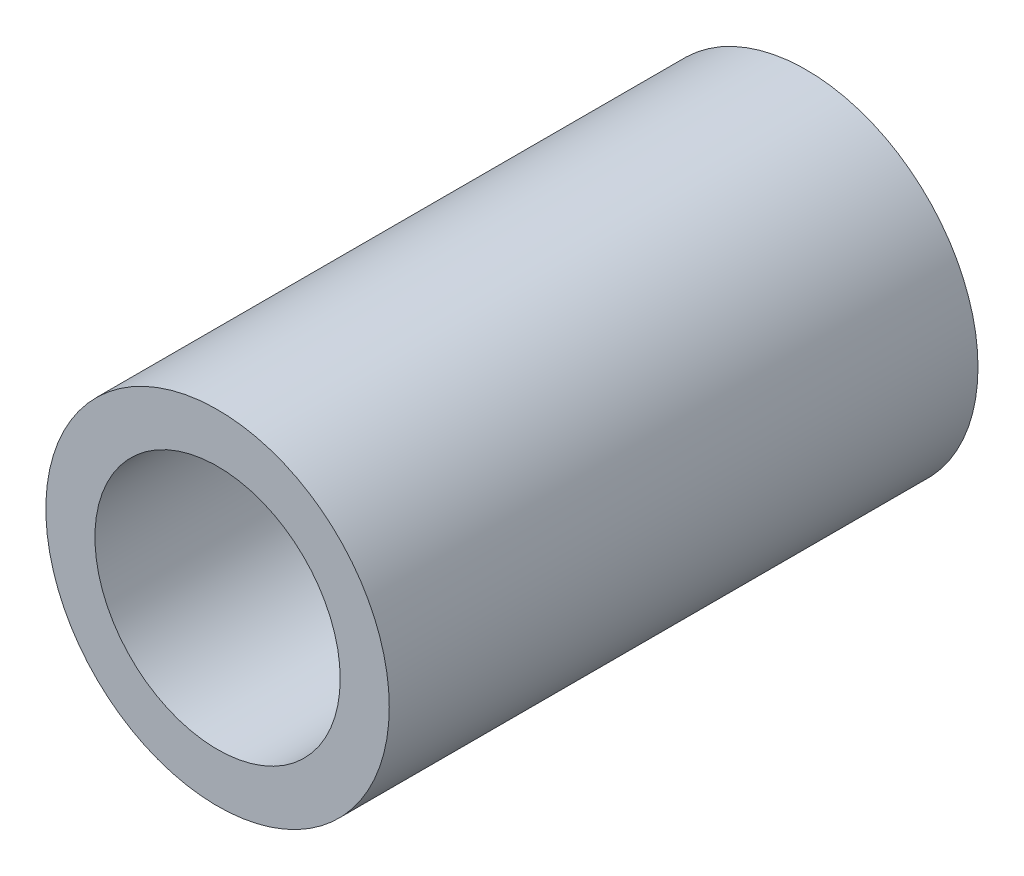
ISO-10303-21;
HEADER;
FILE_DESCRIPTION(('STEP AP214'),'2;1');
FILE_NAME('part.step','',(''),(''),'','','');
FILE_SCHEMA(('AUTOMOTIVE_DESIGN { 1 0 10303 214 1 1 1 1 }'));
ENDSEC;
DATA;
#1=APPLICATION_CONTEXT('core data for automotive mechanical design processes');
#2=APPLICATION_PROTOCOL_DEFINITION('international standard','automotive_design',2000,#1);
#3=PRODUCT_CONTEXT('',#1,'mechanical');
#4=PRODUCT('Part','Part','',(#3));
#5=PRODUCT_RELATED_PRODUCT_CATEGORY('part','',(#4));
#6=PRODUCT_DEFINITION_FORMATION('','',#4);
#7=PRODUCT_DEFINITION_CONTEXT('part definition',#1,'design');
#8=PRODUCT_DEFINITION('design','',#6,#7);
#9=PRODUCT_DEFINITION_SHAPE('','',#8);
#10=(LENGTH_UNIT() NAMED_UNIT(*) SI_UNIT(.MILLI.,.METRE.));
#11=(NAMED_UNIT(*) PLANE_ANGLE_UNIT() SI_UNIT($,.RADIAN.));
#12=(NAMED_UNIT(*) SI_UNIT($,.STERADIAN.) SOLID_ANGLE_UNIT());
#13=UNCERTAINTY_MEASURE_WITH_UNIT(LENGTH_MEASURE(1.E-05),#10,'distance_accuracy_value','');
#14=(GEOMETRIC_REPRESENTATION_CONTEXT(3) GLOBAL_UNCERTAINTY_ASSIGNED_CONTEXT((#13)) GLOBAL_UNIT_ASSIGNED_CONTEXT((#10,
#11,#12)) REPRESENTATION_CONTEXT('',''));
#15=CARTESIAN_POINT('',(0.,0.,0.));
#16=DIRECTION('',(0.,0.,1.));
#17=DIRECTION('',(1.,0.,0.));
#18=AXIS2_PLACEMENT_3D('',#15,#16,#17);
#19=CARTESIAN_POINT('',(0.,0.,12.));
#20=DIRECTION('',(0.,0.,1.));
#21=DIRECTION('',(1.,0.,0.));
#22=AXIS2_PLACEMENT_3D('',#19,#20,#21);
#23=PLANE('',#22);
#24=CARTESIAN_POINT('',(0.,0.,12.));
#25=DIRECTION('',(0.,0.,1.));
#26=DIRECTION('',(1.,0.,0.));
#27=AXIS2_PLACEMENT_3D('',#24,#25,#26);
#28=CIRCLE('',#27,3.5);
#29=CARTESIAN_POINT('',(3.5,0.,12.));
#30=VERTEX_POINT('',#29);
#31=EDGE_CURVE('E10',#30,#30,#28,.T.);
#32=ORIENTED_EDGE('',*,*,#31,.T.);
#33=EDGE_LOOP('',(#32));
#34=FACE_BOUND('',#33,.T.);
#35=CARTESIAN_POINT('',(0.,0.,12.));
#36=DIRECTION('',(0.,0.,1.));
#37=DIRECTION('',(1.,0.,0.));
#38=AXIS2_PLACEMENT_3D('',#35,#36,#37);
#39=CIRCLE('',#38,2.5);
#40=CARTESIAN_POINT('',(2.5,0.,12.));
#41=VERTEX_POINT('',#40);
#42=EDGE_CURVE('E42',#41,#41,#39,.T.);
#43=ORIENTED_EDGE('',*,*,#42,.F.);
#44=EDGE_LOOP('',(#43));
#45=FACE_BOUND('',#44,.T.);
#46=ADVANCED_FACE('F31',(#34,#45),#23,.T.);
#47=CARTESIAN_POINT('',(0.,0.,0.));
#48=DIRECTION('',(0.,0.,1.));
#49=DIRECTION('',(1.,0.,0.));
#50=AXIS2_PLACEMENT_3D('',#47,#48,#49);
#51=PLANE('',#50);
#52=CARTESIAN_POINT('',(0.,0.,0.));
#53=DIRECTION('',(0.,0.,1.));
#54=DIRECTION('',(1.,0.,0.));
#55=AXIS2_PLACEMENT_3D('',#52,#53,#54);
#56=CIRCLE('',#55,3.5);
#57=CARTESIAN_POINT('',(3.5,0.,0.));
#58=VERTEX_POINT('',#57);
#59=EDGE_CURVE('E35',#58,#58,#56,.T.);
#60=ORIENTED_EDGE('',*,*,#59,.F.);
#61=EDGE_LOOP('',(#60));
#62=FACE_BOUND('',#61,.T.);
#63=CARTESIAN_POINT('',(0.,0.,0.));
#64=DIRECTION('',(0.,0.,1.));
#65=DIRECTION('',(1.,0.,0.));
#66=AXIS2_PLACEMENT_3D('',#63,#64,#65);
#67=CIRCLE('',#66,2.5);
#68=CARTESIAN_POINT('',(2.5,0.,0.));
#69=VERTEX_POINT('',#68);
#70=EDGE_CURVE('E44',#69,#69,#67,.T.);
#71=ORIENTED_EDGE('',*,*,#70,.T.);
#72=EDGE_LOOP('',(#71));
#73=FACE_BOUND('',#72,.T.);
#74=ADVANCED_FACE('F54',(#62,#73),#51,.F.);
#75=CARTESIAN_POINT('',(0.,0.,12.));
#76=DIRECTION('',(0.,0.,-1.));
#77=DIRECTION('',(-1.,0.,0.));
#78=AXIS2_PLACEMENT_3D('',#75,#76,#77);
#79=CYLINDRICAL_SURFACE('',#78,3.5);
#80=ORIENTED_EDGE('',*,*,#31,.F.);
#81=EDGE_LOOP('',(#80));
#82=FACE_BOUND('',#81,.T.);
#83=ORIENTED_EDGE('',*,*,#59,.T.);
#84=EDGE_LOOP('',(#83));
#85=FACE_BOUND('',#84,.T.);
#86=ADVANCED_FACE('F33',(#82,#85),#79,.T.);
#87=CARTESIAN_POINT('',(0.,0.,12.));
#88=DIRECTION('',(0.,0.,-1.));
#89=DIRECTION('',(-1.,0.,0.));
#90=AXIS2_PLACEMENT_3D('',#87,#88,#89);
#91=CYLINDRICAL_SURFACE('',#90,2.5);
#92=ORIENTED_EDGE('',*,*,#42,.T.);
#93=EDGE_LOOP('',(#92));
#94=FACE_BOUND('',#93,.T.);
#95=ORIENTED_EDGE('',*,*,#70,.F.);
#96=EDGE_LOOP('',(#95));
#97=FACE_BOUND('',#96,.T.);
#98=ADVANCED_FACE('F50',(#94,#97),#91,.F.);
#99=CLOSED_SHELL('',(#46,#74,#86,#98));
#100=MANIFOLD_SOLID_BREP('B2',#99);
#101=ADVANCED_BREP_SHAPE_REPRESENTATION('',(#18,#100),#14);
#102=SHAPE_DEFINITION_REPRESENTATION(#9,#101);
ENDSEC;
END-ISO-10303-21;
